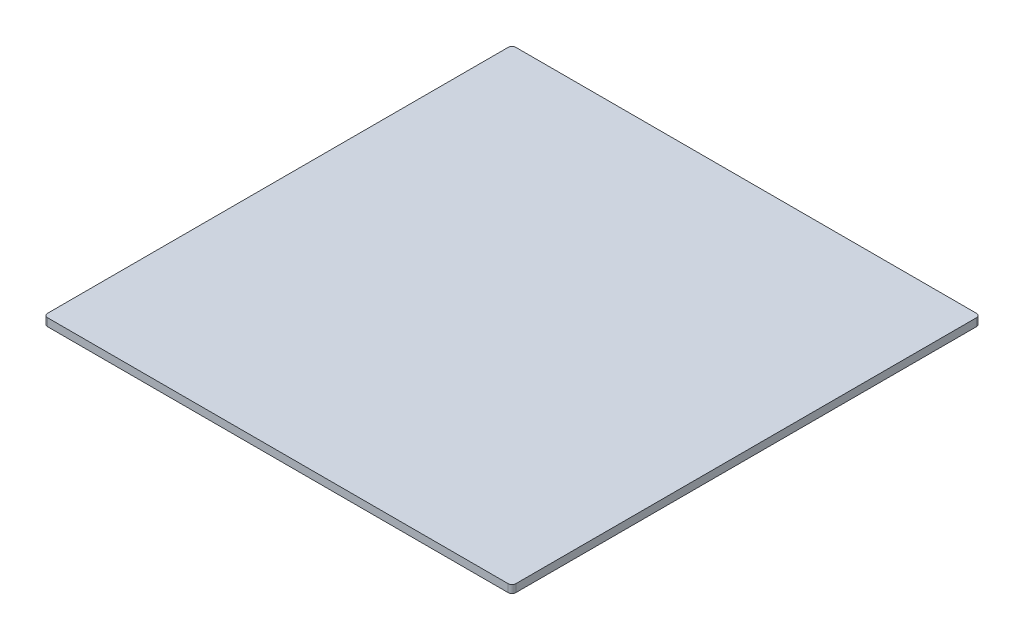
ISO-10303-21;
HEADER;
FILE_DESCRIPTION(('STEP AP214'),'2;1');
FILE_NAME('part.step','',(''),(''),'','','');
FILE_SCHEMA(('AUTOMOTIVE_DESIGN { 1 0 10303 214 1 1 1 1 }'));
ENDSEC;
DATA;
#1=APPLICATION_CONTEXT('core data for automotive mechanical design processes');
#2=APPLICATION_PROTOCOL_DEFINITION('international standard','automotive_design',2000,#1);
#3=PRODUCT_CONTEXT('',#1,'mechanical');
#4=PRODUCT('Part','Part','',(#3));
#5=PRODUCT_RELATED_PRODUCT_CATEGORY('part','',(#4));
#6=PRODUCT_DEFINITION_FORMATION('','',#4);
#7=PRODUCT_DEFINITION_CONTEXT('part definition',#1,'design');
#8=PRODUCT_DEFINITION('design','',#6,#7);
#9=PRODUCT_DEFINITION_SHAPE('','',#8);
#10=(LENGTH_UNIT() NAMED_UNIT(*) SI_UNIT(.MILLI.,.METRE.));
#11=(NAMED_UNIT(*) PLANE_ANGLE_UNIT() SI_UNIT($,.RADIAN.));
#12=(NAMED_UNIT(*) SI_UNIT($,.STERADIAN.) SOLID_ANGLE_UNIT());
#13=UNCERTAINTY_MEASURE_WITH_UNIT(LENGTH_MEASURE(1.E-05),#10,'distance_accuracy_value','');
#14=(GEOMETRIC_REPRESENTATION_CONTEXT(3) GLOBAL_UNCERTAINTY_ASSIGNED_CONTEXT((#13)) GLOBAL_UNIT_ASSIGNED_CONTEXT((#10,
#11,#12)) REPRESENTATION_CONTEXT('',''));
#15=CARTESIAN_POINT('',(0.,0.,0.));
#16=DIRECTION('',(0.,0.,1.));
#17=DIRECTION('',(1.,0.,0.));
#18=AXIS2_PLACEMENT_3D('',#15,#16,#17);
#19=CARTESIAN_POINT('',(91.2971919569936,2.,-177.616125956132));
#20=DIRECTION('',(0.,-1.,0.));
#21=DIRECTION('',(0.,0.,-1.));
#22=AXIS2_PLACEMENT_3D('',#19,#20,#21);
#23=CYLINDRICAL_SURFACE('',#22,1.);
#24=CARTESIAN_POINT('',(91.2971919569936,0.,-177.616125956132));
#25=DIRECTION('',(0.,1.,0.));
#26=DIRECTION('',(0.,0.,-1.));
#27=AXIS2_PLACEMENT_3D('',#24,#25,#26);
#28=CIRCLE('',#27,1.);
#29=CARTESIAN_POINT('',(92.2971919569936,0.,-177.616125956132));
#30=VERTEX_POINT('',#29);
#31=CARTESIAN_POINT('',(91.2971919569936,0.,-178.616125956132));
#32=VERTEX_POINT('',#31);
#33=EDGE_CURVE('E128',#30,#32,#28,.T.);
#34=ORIENTED_EDGE('',*,*,#33,.T.);
#35=DIRECTION('',(0.,-1.,0.));
#36=VECTOR('',#35,1.);
#37=CARTESIAN_POINT('',(91.2971919569936,2.,-178.616125956132));
#38=LINE('',#37,#36);
#39=CARTESIAN_POINT('',(91.2971919569936,2.,-178.616125956132));
#40=VERTEX_POINT('',#39);
#41=EDGE_CURVE('E11',#40,#32,#38,.T.);
#42=ORIENTED_EDGE('',*,*,#41,.F.);
#43=CARTESIAN_POINT('',(91.2971919569936,2.,-177.616125956132));
#44=DIRECTION('',(0.,1.,0.));
#45=DIRECTION('',(0.,0.,-1.));
#46=AXIS2_PLACEMENT_3D('',#43,#44,#45);
#47=CIRCLE('',#46,1.);
#48=CARTESIAN_POINT('',(92.2971919569936,2.,-177.616125956132));
#49=VERTEX_POINT('',#48);
#50=EDGE_CURVE('E142',#49,#40,#47,.T.);
#51=ORIENTED_EDGE('',*,*,#50,.F.);
#52=DIRECTION('',(0.,-1.,0.));
#53=VECTOR('',#52,1.);
#54=CARTESIAN_POINT('',(92.2971919569936,2.,-177.616125956132));
#55=LINE('',#54,#53);
#56=EDGE_CURVE('E124',#49,#30,#55,.T.);
#57=ORIENTED_EDGE('',*,*,#56,.T.);
#58=EDGE_LOOP('',(#34,#42,#51,#57));
#59=FACE_BOUND('',#58,.T.);
#60=ADVANCED_FACE('F32',(#59),#23,.T.);
#61=CARTESIAN_POINT('',(-26.7028080430064,2.,-178.616125956132));
#62=DIRECTION('',(0.,0.,1.));
#63=DIRECTION('',(1.,0.,0.));
#64=AXIS2_PLACEMENT_3D('',#61,#62,#63);
#65=PLANE('',#64);
#66=DIRECTION('',(-1.,0.,0.));
#67=VECTOR('',#66,1.);
#68=CARTESIAN_POINT('',(-26.7028080430064,0.,-178.616125956132));
#69=LINE('',#68,#67);
#70=CARTESIAN_POINT('',(-26.7028080430064,0.,-178.616125956132));
#71=VERTEX_POINT('',#70);
#72=EDGE_CURVE('E131',#32,#71,#69,.T.);
#73=ORIENTED_EDGE('',*,*,#72,.T.);
#74=DIRECTION('',(0.,-1.,0.));
#75=VECTOR('',#74,1.);
#76=CARTESIAN_POINT('',(-26.7028080430064,2.,-178.616125956132));
#77=LINE('',#76,#75);
#78=CARTESIAN_POINT('',(-26.7028080430064,2.,-178.616125956132));
#79=VERTEX_POINT('',#78);
#80=EDGE_CURVE('E40',#79,#71,#77,.T.);
#81=ORIENTED_EDGE('',*,*,#80,.F.);
#82=DIRECTION('',(-1.,0.,0.));
#83=VECTOR('',#82,1.);
#84=CARTESIAN_POINT('',(-26.7028080430064,2.,-178.616125956132));
#85=LINE('',#84,#83);
#86=EDGE_CURVE('E91',#40,#79,#85,.T.);
#87=ORIENTED_EDGE('',*,*,#86,.F.);
#88=ORIENTED_EDGE('',*,*,#41,.T.);
#89=EDGE_LOOP('',(#73,#81,#87,#88));
#90=FACE_BOUND('',#89,.T.);
#91=ADVANCED_FACE('F177',(#90),#65,.F.);
#92=CARTESIAN_POINT('',(-26.7028080430064,2.,-177.616125956132));
#93=DIRECTION('',(0.,-1.,0.));
#94=DIRECTION('',(0.,0.,-1.));
#95=AXIS2_PLACEMENT_3D('',#92,#93,#94);
#96=CYLINDRICAL_SURFACE('',#95,1.);
#97=CARTESIAN_POINT('',(-26.7028080430064,0.,-177.616125956132));
#98=DIRECTION('',(0.,1.,0.));
#99=DIRECTION('',(0.,0.,1.));
#100=AXIS2_PLACEMENT_3D('',#97,#98,#99);
#101=CIRCLE('',#100,1.);
#102=CARTESIAN_POINT('',(-27.7028080430064,0.,-177.616125956132));
#103=VERTEX_POINT('',#102);
#104=EDGE_CURVE('E133',#71,#103,#101,.T.);
#105=ORIENTED_EDGE('',*,*,#104,.T.);
#106=DIRECTION('',(0.,-1.,0.));
#107=VECTOR('',#106,1.);
#108=CARTESIAN_POINT('',(-27.7028080430064,2.,-177.616125956132));
#109=LINE('',#108,#107);
#110=CARTESIAN_POINT('',(-27.7028080430064,2.,-177.616125956132));
#111=VERTEX_POINT('',#110);
#112=EDGE_CURVE('E149',#111,#103,#109,.T.);
#113=ORIENTED_EDGE('',*,*,#112,.F.);
#114=CARTESIAN_POINT('',(-26.7028080430064,2.,-177.616125956132));
#115=DIRECTION('',(0.,1.,0.));
#116=DIRECTION('',(0.,0.,1.));
#117=AXIS2_PLACEMENT_3D('',#114,#115,#116);
#118=CIRCLE('',#117,1.);
#119=EDGE_CURVE('E157',#79,#111,#118,.T.);
#120=ORIENTED_EDGE('',*,*,#119,.F.);
#121=ORIENTED_EDGE('',*,*,#80,.T.);
#122=EDGE_LOOP('',(#105,#113,#120,#121));
#123=FACE_BOUND('',#122,.T.);
#124=ADVANCED_FACE('F155',(#123),#96,.T.);
#125=CARTESIAN_POINT('',(-27.7028080430064,2.,-177.616125956132));
#126=DIRECTION('',(1.,0.,0.));
#127=DIRECTION('',(0.,0.,-1.));
#128=AXIS2_PLACEMENT_3D('',#125,#126,#127);
#129=PLANE('',#128);
#130=DIRECTION('',(0.,0.,1.));
#131=VECTOR('',#130,1.);
#132=CARTESIAN_POINT('',(-27.7028080430064,0.,-177.616125956132));
#133=LINE('',#132,#131);
#134=CARTESIAN_POINT('',(-27.7028080430064,0.,-59.6161259561315));
#135=VERTEX_POINT('',#134);
#136=EDGE_CURVE('E135',#103,#135,#133,.T.);
#137=ORIENTED_EDGE('',*,*,#136,.T.);
#138=DIRECTION('',(0.,-1.,0.));
#139=VECTOR('',#138,1.);
#140=CARTESIAN_POINT('',(-27.7028080430064,2.,-59.6161259561315));
#141=LINE('',#140,#139);
#142=CARTESIAN_POINT('',(-27.7028080430064,2.,-59.6161259561315));
#143=VERTEX_POINT('',#142);
#144=EDGE_CURVE('E146',#143,#135,#141,.T.);
#145=ORIENTED_EDGE('',*,*,#144,.F.);
#146=DIRECTION('',(0.,0.,1.));
#147=VECTOR('',#146,1.);
#148=CARTESIAN_POINT('',(-27.7028080430064,2.,-177.616125956132));
#149=LINE('',#148,#147);
#150=EDGE_CURVE('E169',#111,#143,#149,.T.);
#151=ORIENTED_EDGE('',*,*,#150,.F.);
#152=ORIENTED_EDGE('',*,*,#112,.T.);
#153=EDGE_LOOP('',(#137,#145,#151,#152));
#154=FACE_BOUND('',#153,.T.);
#155=ADVANCED_FACE('F165',(#154),#129,.F.);
#156=CARTESIAN_POINT('',(-26.7028080430064,2.,-59.6161259561315));
#157=DIRECTION('',(0.,-1.,0.));
#158=DIRECTION('',(0.,0.,-1.));
#159=AXIS2_PLACEMENT_3D('',#156,#157,#158);
#160=CYLINDRICAL_SURFACE('',#159,1.);
#161=CARTESIAN_POINT('',(-26.7028080430064,0.,-59.6161259561315));
#162=DIRECTION('',(0.,1.,0.));
#163=DIRECTION('',(0.,0.,1.));
#164=AXIS2_PLACEMENT_3D('',#161,#162,#163);
#165=CIRCLE('',#164,1.);
#166=CARTESIAN_POINT('',(-26.7028080430064,0.,-58.6161259561315));
#167=VERTEX_POINT('',#166);
#168=EDGE_CURVE('E137',#135,#167,#165,.T.);
#169=ORIENTED_EDGE('',*,*,#168,.T.);
#170=DIRECTION('',(0.,-1.,0.));
#171=VECTOR('',#170,1.);
#172=CARTESIAN_POINT('',(-26.7028080430064,2.,-58.6161259561315));
#173=LINE('',#172,#171);
#174=CARTESIAN_POINT('',(-26.7028080430064,2.,-58.6161259561315));
#175=VERTEX_POINT('',#174);
#176=EDGE_CURVE('E119',#175,#167,#173,.T.);
#177=ORIENTED_EDGE('',*,*,#176,.F.);
#178=CARTESIAN_POINT('',(-26.7028080430064,2.,-59.6161259561315));
#179=DIRECTION('',(0.,1.,0.));
#180=DIRECTION('',(0.,0.,1.));
#181=AXIS2_PLACEMENT_3D('',#178,#179,#180);
#182=CIRCLE('',#181,1.);
#183=EDGE_CURVE('E110',#143,#175,#182,.T.);
#184=ORIENTED_EDGE('',*,*,#183,.F.);
#185=ORIENTED_EDGE('',*,*,#144,.T.);
#186=EDGE_LOOP('',(#169,#177,#184,#185));
#187=FACE_BOUND('',#186,.T.);
#188=ADVANCED_FACE('F168',(#187),#160,.T.);
#189=CARTESIAN_POINT('',(-26.7028080430064,2.,-58.6161259561315));
#190=DIRECTION('',(0.,0.,-1.));
#191=DIRECTION('',(-1.,0.,0.));
#192=AXIS2_PLACEMENT_3D('',#189,#190,#191);
#193=PLANE('',#192);
#194=DIRECTION('',(1.,0.,0.));
#195=VECTOR('',#194,1.);
#196=CARTESIAN_POINT('',(-26.7028080430064,0.,-58.6161259561315));
#197=LINE('',#196,#195);
#198=CARTESIAN_POINT('',(91.2971919569936,0.,-58.6161259561315));
#199=VERTEX_POINT('',#198);
#200=EDGE_CURVE('E118',#167,#199,#197,.T.);
#201=ORIENTED_EDGE('',*,*,#200,.T.);
#202=DIRECTION('',(0.,-1.,0.));
#203=VECTOR('',#202,1.);
#204=CARTESIAN_POINT('',(91.2971919569936,2.,-58.6161259561315));
#205=LINE('',#204,#203);
#206=CARTESIAN_POINT('',(91.2971919569936,2.,-58.6161259561315));
#207=VERTEX_POINT('',#206);
#208=EDGE_CURVE('E115',#207,#199,#205,.T.);
#209=ORIENTED_EDGE('',*,*,#208,.F.);
#210=DIRECTION('',(1.,0.,0.));
#211=VECTOR('',#210,1.);
#212=CARTESIAN_POINT('',(-26.7028080430064,2.,-58.6161259561315));
#213=LINE('',#212,#211);
#214=EDGE_CURVE('E104',#175,#207,#213,.T.);
#215=ORIENTED_EDGE('',*,*,#214,.F.);
#216=ORIENTED_EDGE('',*,*,#176,.T.);
#217=EDGE_LOOP('',(#201,#209,#215,#216));
#218=FACE_BOUND('',#217,.T.);
#219=ADVANCED_FACE('F116',(#218),#193,.F.);
#220=CARTESIAN_POINT('',(91.2971919569936,2.,-59.6161259561315));
#221=DIRECTION('',(0.,-1.,0.));
#222=DIRECTION('',(0.,0.,-1.));
#223=AXIS2_PLACEMENT_3D('',#220,#221,#222);
#224=CYLINDRICAL_SURFACE('',#223,1.);
#225=CARTESIAN_POINT('',(91.2971919569936,0.,-59.6161259561315));
#226=DIRECTION('',(0.,1.,0.));
#227=DIRECTION('',(0.,0.,1.));
#228=AXIS2_PLACEMENT_3D('',#225,#226,#227);
#229=CIRCLE('',#228,1.);
#230=CARTESIAN_POINT('',(92.2971919569936,0.,-59.6161259561315));
#231=VERTEX_POINT('',#230);
#232=EDGE_CURVE('E77',#199,#231,#229,.T.);
#233=ORIENTED_EDGE('',*,*,#232,.T.);
#234=DIRECTION('',(0.,-1.,0.));
#235=VECTOR('',#234,1.);
#236=CARTESIAN_POINT('',(92.2971919569936,2.,-59.6161259561315));
#237=LINE('',#236,#235);
#238=CARTESIAN_POINT('',(92.2971919569936,2.,-59.6161259561315));
#239=VERTEX_POINT('',#238);
#240=EDGE_CURVE('E120',#239,#231,#237,.T.);
#241=ORIENTED_EDGE('',*,*,#240,.F.);
#242=CARTESIAN_POINT('',(91.2971919569936,2.,-59.6161259561315));
#243=DIRECTION('',(0.,1.,0.));
#244=DIRECTION('',(0.,0.,1.));
#245=AXIS2_PLACEMENT_3D('',#242,#243,#244);
#246=CIRCLE('',#245,1.);
#247=EDGE_CURVE('E108',#207,#239,#246,.T.);
#248=ORIENTED_EDGE('',*,*,#247,.F.);
#249=ORIENTED_EDGE('',*,*,#208,.T.);
#250=EDGE_LOOP('',(#233,#241,#248,#249));
#251=FACE_BOUND('',#250,.T.);
#252=ADVANCED_FACE('F122',(#251),#224,.T.);
#253=CARTESIAN_POINT('',(92.2971919569936,2.,-177.616125956132));
#254=DIRECTION('',(-1.,0.,0.));
#255=DIRECTION('',(0.,0.,1.));
#256=AXIS2_PLACEMENT_3D('',#253,#254,#255);
#257=PLANE('',#256);
#258=DIRECTION('',(0.,0.,-1.));
#259=VECTOR('',#258,1.);
#260=CARTESIAN_POINT('',(92.2971919569936,0.,-177.616125956132));
#261=LINE('',#260,#259);
#262=EDGE_CURVE('E83',#231,#30,#261,.T.);
#263=ORIENTED_EDGE('',*,*,#262,.T.);
#264=ORIENTED_EDGE('',*,*,#56,.F.);
#265=DIRECTION('',(0.,0.,-1.));
#266=VECTOR('',#265,1.);
#267=CARTESIAN_POINT('',(92.2971919569936,2.,-177.616125956132));
#268=LINE('',#267,#266);
#269=EDGE_CURVE('E48',#239,#49,#268,.T.);
#270=ORIENTED_EDGE('',*,*,#269,.F.);
#271=ORIENTED_EDGE('',*,*,#240,.T.);
#272=EDGE_LOOP('',(#263,#264,#270,#271));
#273=FACE_BOUND('',#272,.T.);
#274=ADVANCED_FACE('F193',(#273),#257,.F.);
#275=CARTESIAN_POINT('',(91.2971919569936,2.,-177.616125956132));
#276=DIRECTION('',(0.,-1.,0.));
#277=DIRECTION('',(0.,0.,-1.));
#278=AXIS2_PLACEMENT_3D('',#275,#276,#277);
#279=PLANE('',#278);
#280=ORIENTED_EDGE('',*,*,#50,.T.);
#281=ORIENTED_EDGE('',*,*,#86,.T.);
#282=ORIENTED_EDGE('',*,*,#119,.T.);
#283=ORIENTED_EDGE('',*,*,#150,.T.);
#284=ORIENTED_EDGE('',*,*,#183,.T.);
#285=ORIENTED_EDGE('',*,*,#214,.T.);
#286=ORIENTED_EDGE('',*,*,#247,.T.);
#287=ORIENTED_EDGE('',*,*,#269,.T.);
#288=EDGE_LOOP('',(#280,#281,#282,#283,#284,#285,#286,#287));
#289=FACE_BOUND('',#288,.T.);
#290=ADVANCED_FACE('F106',(#289),#279,.F.);
#291=CARTESIAN_POINT('',(91.2971919569936,0.,-177.616125956132));
#292=DIRECTION('',(0.,-1.,0.));
#293=DIRECTION('',(0.,0.,-1.));
#294=AXIS2_PLACEMENT_3D('',#291,#292,#293);
#295=PLANE('',#294);
#296=ORIENTED_EDGE('',*,*,#33,.F.);
#297=ORIENTED_EDGE('',*,*,#262,.F.);
#298=ORIENTED_EDGE('',*,*,#232,.F.);
#299=ORIENTED_EDGE('',*,*,#200,.F.);
#300=ORIENTED_EDGE('',*,*,#168,.F.);
#301=ORIENTED_EDGE('',*,*,#136,.F.);
#302=ORIENTED_EDGE('',*,*,#104,.F.);
#303=ORIENTED_EDGE('',*,*,#72,.F.);
#304=EDGE_LOOP('',(#296,#297,#298,#299,#300,#301,#302,#303));
#305=FACE_BOUND('',#304,.T.);
#306=ADVANCED_FACE('F161',(#305),#295,.T.);
#307=CLOSED_SHELL('',(#60,#91,#124,#155,#188,#219,#252,#274,#290,#306));
#308=MANIFOLD_SOLID_BREP('B2',#307);
#309=ADVANCED_BREP_SHAPE_REPRESENTATION('',(#18,#308),#14);
#310=SHAPE_DEFINITION_REPRESENTATION(#9,#309);
ENDSEC;
END-ISO-10303-21;
